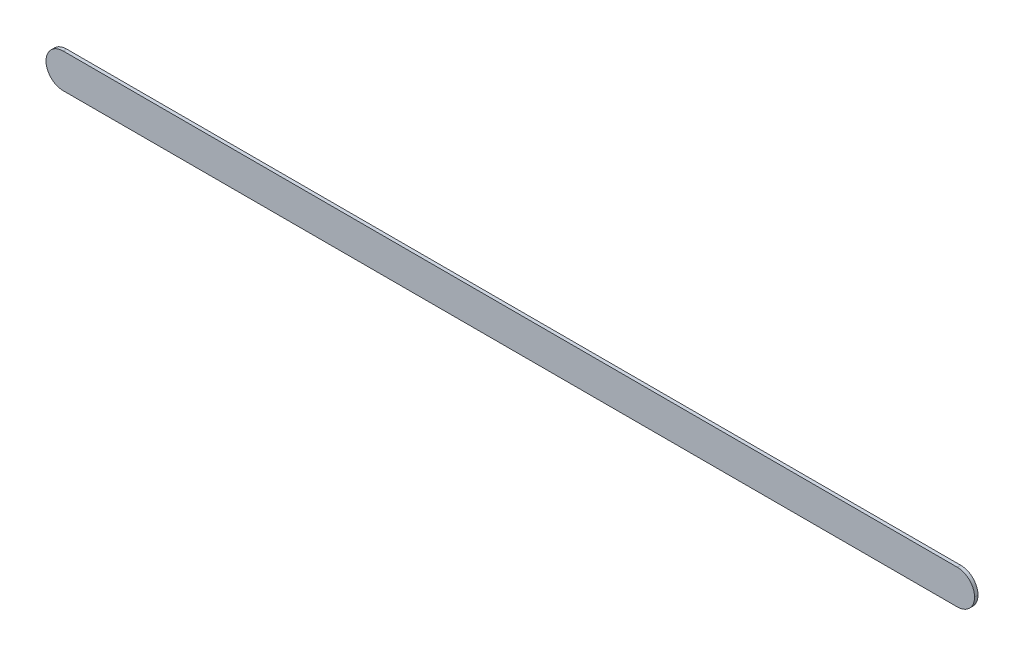
ISO-10303-21;
HEADER;
FILE_DESCRIPTION(('STEP AP214'),'2;1');
FILE_NAME('part.step','',(''),(''),'','','');
FILE_SCHEMA(('AUTOMOTIVE_DESIGN { 1 0 10303 214 1 1 1 1 }'));
ENDSEC;
DATA;
#1=APPLICATION_CONTEXT('core data for automotive mechanical design processes');
#2=APPLICATION_PROTOCOL_DEFINITION('international standard','automotive_design',2000,#1);
#3=PRODUCT_CONTEXT('',#1,'mechanical');
#4=PRODUCT('Part','Part','',(#3));
#5=PRODUCT_RELATED_PRODUCT_CATEGORY('part','',(#4));
#6=PRODUCT_DEFINITION_FORMATION('','',#4);
#7=PRODUCT_DEFINITION_CONTEXT('part definition',#1,'design');
#8=PRODUCT_DEFINITION('design','',#6,#7);
#9=PRODUCT_DEFINITION_SHAPE('','',#8);
#10=(LENGTH_UNIT() NAMED_UNIT(*) SI_UNIT(.MILLI.,.METRE.));
#11=(NAMED_UNIT(*) PLANE_ANGLE_UNIT() SI_UNIT($,.RADIAN.));
#12=(NAMED_UNIT(*) SI_UNIT($,.STERADIAN.) SOLID_ANGLE_UNIT());
#13=UNCERTAINTY_MEASURE_WITH_UNIT(LENGTH_MEASURE(1.E-05),#10,'distance_accuracy_value','');
#14=(GEOMETRIC_REPRESENTATION_CONTEXT(3) GLOBAL_UNCERTAINTY_ASSIGNED_CONTEXT((#13)) GLOBAL_UNIT_ASSIGNED_CONTEXT((#10,
#11,#12)) REPRESENTATION_CONTEXT('',''));
#15=CARTESIAN_POINT('',(0.,0.,0.));
#16=DIRECTION('',(0.,0.,1.));
#17=DIRECTION('',(1.,0.,0.));
#18=AXIS2_PLACEMENT_3D('',#15,#16,#17);
#19=CARTESIAN_POINT('',(16.299999393024,35.383999023438,0.0127));
#20=DIRECTION('',(0.,0.,1.));
#21=DIRECTION('',(1.,0.,0.));
#22=AXIS2_PLACEMENT_3D('',#19,#20,#21);
#23=PLANE('',#22);
#24=CARTESIAN_POINT('',(17.950998535145,35.383999023438,0.0127));
#25=DIRECTION('',(0.,0.,-1.));
#26=DIRECTION('',(1.,0.,0.));
#27=AXIS2_PLACEMENT_3D('',#24,#25,#26);
#28=CIRCLE('',#27,0.06350097657423);
#29=CARTESIAN_POINT('',(17.950999145502,35.4475,0.0127));
#30=VERTEX_POINT('',#29);
#31=CARTESIAN_POINT('',(18.014499511719,35.383999023438,0.0127));
#32=VERTEX_POINT('',#31);
#33=EDGE_CURVE('E28',#30,#32,#28,.T.);
#34=ORIENTED_EDGE('',*,*,#33,.F.);
#35=DIRECTION('',(-1.,0.,0.));
#36=VECTOR('',#35,1.);
#37=CARTESIAN_POINT('',(14.649000244141,35.4475,0.0127));
#38=LINE('',#37,#36);
#39=CARTESIAN_POINT('',(14.649000244141,35.4475,0.0127));
#40=VERTEX_POINT('',#39);
#41=EDGE_CURVE('E87',#30,#40,#38,.T.);
#42=ORIENTED_EDGE('',*,*,#41,.T.);
#43=CARTESIAN_POINT('',(14.649000244141,35.383999023438,0.0127));
#44=DIRECTION('',(0.,0.,1.));
#45=DIRECTION('',(1.,0.,0.));
#46=AXIS2_PLACEMENT_3D('',#43,#44,#45);
#47=CIRCLE('',#46,0.0635009765625);
#48=CARTESIAN_POINT('',(14.649000244141,35.320498046875,0.0127));
#49=VERTEX_POINT('',#48);
#50=EDGE_CURVE('E115',#40,#49,#47,.T.);
#51=ORIENTED_EDGE('',*,*,#50,.T.);
#52=DIRECTION('',(1.,0.,0.));
#53=VECTOR('',#52,1.);
#54=CARTESIAN_POINT('',(17.950999755859,35.320498046875,0.0127));
#55=LINE('',#54,#53);
#56=CARTESIAN_POINT('',(17.950999145502,35.320498046875,0.0127));
#57=VERTEX_POINT('',#56);
#58=EDGE_CURVE('E11',#49,#57,#55,.T.);
#59=ORIENTED_EDGE('',*,*,#58,.T.);
#60=CARTESIAN_POINT('',(17.950998535145,35.383999023438,0.0127));
#61=DIRECTION('',(0.,0.,-1.));
#62=DIRECTION('',(1.,0.,0.));
#63=AXIS2_PLACEMENT_3D('',#60,#61,#62);
#64=CIRCLE('',#63,0.06350097657423);
#65=EDGE_CURVE('E90',#32,#57,#64,.T.);
#66=ORIENTED_EDGE('',*,*,#65,.F.);
#67=EDGE_LOOP('',(#34,#42,#51,#59,#66));
#68=FACE_BOUND('',#67,.T.);
#69=ADVANCED_FACE('F17',(#68),#23,.T.);
#70=CARTESIAN_POINT('',(17.950999755859,35.320498046875,0.));
#71=DIRECTION('',(0.,1.,0.));
#72=DIRECTION('',(1.,0.,0.));
#73=AXIS2_PLACEMENT_3D('',#70,#71,#72);
#74=PLANE('',#73);
#75=DIRECTION('',(0.,0.,1.));
#76=VECTOR('',#75,1.);
#77=CARTESIAN_POINT('',(14.649000244141,35.320498046875,0.));
#78=LINE('',#77,#76);
#79=CARTESIAN_POINT('',(14.649000244141,35.320498046875,0.));
#80=VERTEX_POINT('',#79);
#81=EDGE_CURVE('E119',#80,#49,#78,.T.);
#82=ORIENTED_EDGE('',*,*,#81,.F.);
#83=DIRECTION('',(1.,0.,0.));
#84=VECTOR('',#83,1.);
#85=CARTESIAN_POINT('',(16.299999393024,35.320498046875,0.));
#86=LINE('',#85,#84);
#87=CARTESIAN_POINT('',(17.950999145502,35.320498046875,0.));
#88=VERTEX_POINT('',#87);
#89=EDGE_CURVE('E110',#80,#88,#86,.T.);
#90=ORIENTED_EDGE('',*,*,#89,.T.);
#91=DIRECTION('',(0.,0.,-1.));
#92=VECTOR('',#91,1.);
#93=CARTESIAN_POINT('',(17.950999755859,35.320498046875,0.));
#94=LINE('',#93,#92);
#95=EDGE_CURVE('E96',#57,#88,#94,.T.);
#96=ORIENTED_EDGE('',*,*,#95,.F.);
#97=ORIENTED_EDGE('',*,*,#58,.F.);
#98=EDGE_LOOP('',(#82,#90,#96,#97));
#99=FACE_BOUND('',#98,.T.);
#100=ADVANCED_FACE('F180',(#99),#74,.F.);
#101=CARTESIAN_POINT('',(17.950998535145,35.383999023438,0.));
#102=DIRECTION('',(0.,0.,1.));
#103=DIRECTION('',(1.,0.,0.));
#104=AXIS2_PLACEMENT_3D('',#101,#102,#103);
#105=CYLINDRICAL_SURFACE('',#104,0.06350097657423);
#106=DIRECTION('',(0.,0.,1.));
#107=VECTOR('',#106,1.);
#108=CARTESIAN_POINT('',(18.014499511719,35.383999023438,0.));
#109=LINE('',#108,#107);
#110=CARTESIAN_POINT('',(18.014499511719,35.383999023438,0.));
#111=VERTEX_POINT('',#110);
#112=EDGE_CURVE('E84',#111,#32,#109,.T.);
#113=ORIENTED_EDGE('',*,*,#112,.F.);
#114=CARTESIAN_POINT('',(17.950998535145,35.383999023438,0.));
#115=DIRECTION('',(0.,0.,1.));
#116=DIRECTION('',(1.,0.,0.));
#117=AXIS2_PLACEMENT_3D('',#114,#115,#116);
#118=CIRCLE('',#117,0.06350097657423);
#119=CARTESIAN_POINT('',(17.950999145502,35.4475,0.));
#120=VERTEX_POINT('',#119);
#121=EDGE_CURVE('E76',#111,#120,#118,.T.);
#122=ORIENTED_EDGE('',*,*,#121,.T.);
#123=DIRECTION('',(0.,0.,1.));
#124=VECTOR('',#123,1.);
#125=CARTESIAN_POINT('',(17.950999755859,35.4475,0.));
#126=LINE('',#125,#124);
#127=EDGE_CURVE('E21',#120,#30,#126,.T.);
#128=ORIENTED_EDGE('',*,*,#127,.T.);
#129=ORIENTED_EDGE('',*,*,#33,.T.);
#130=EDGE_LOOP('',(#113,#122,#128,#129));
#131=FACE_BOUND('',#130,.T.);
#132=ADVANCED_FACE('F82',(#131),#105,.T.);
#133=CARTESIAN_POINT('',(14.649000244141,35.4475,0.));
#134=DIRECTION('',(0.,-1.,0.));
#135=DIRECTION('',(0.,0.,-1.));
#136=AXIS2_PLACEMENT_3D('',#133,#134,#135);
#137=PLANE('',#136);
#138=ORIENTED_EDGE('',*,*,#127,.F.);
#139=DIRECTION('',(-1.,0.,0.));
#140=VECTOR('',#139,1.);
#141=CARTESIAN_POINT('',(16.299999393024,35.4475,0.));
#142=LINE('',#141,#140);
#143=CARTESIAN_POINT('',(14.649000244141,35.4475,0.));
#144=VERTEX_POINT('',#143);
#145=EDGE_CURVE('E111',#120,#144,#142,.T.);
#146=ORIENTED_EDGE('',*,*,#145,.T.);
#147=DIRECTION('',(0.,0.,-1.));
#148=VECTOR('',#147,1.);
#149=CARTESIAN_POINT('',(14.649000244141,35.4475,0.));
#150=LINE('',#149,#148);
#151=EDGE_CURVE('E112',#40,#144,#150,.T.);
#152=ORIENTED_EDGE('',*,*,#151,.F.);
#153=ORIENTED_EDGE('',*,*,#41,.F.);
#154=EDGE_LOOP('',(#138,#146,#152,#153));
#155=FACE_BOUND('',#154,.T.);
#156=ADVANCED_FACE('F185',(#155),#137,.F.);
#157=CARTESIAN_POINT('',(14.649000244141,35.383999023438,0.));
#158=DIRECTION('',(0.,0.,1.));
#159=DIRECTION('',(1.,0.,0.));
#160=AXIS2_PLACEMENT_3D('',#157,#158,#159);
#161=CYLINDRICAL_SURFACE('',#160,0.0635009765625);
#162=CARTESIAN_POINT('',(14.649000244141,35.383999023438,0.));
#163=DIRECTION('',(0.,0.,1.));
#164=DIRECTION('',(1.,0.,0.));
#165=AXIS2_PLACEMENT_3D('',#162,#163,#164);
#166=CIRCLE('',#165,0.0635009765625);
#167=EDGE_CURVE('E116',#144,#80,#166,.T.);
#168=ORIENTED_EDGE('',*,*,#167,.T.);
#169=ORIENTED_EDGE('',*,*,#81,.T.);
#170=ORIENTED_EDGE('',*,*,#50,.F.);
#171=ORIENTED_EDGE('',*,*,#151,.T.);
#172=EDGE_LOOP('',(#168,#169,#170,#171));
#173=FACE_BOUND('',#172,.T.);
#174=ADVANCED_FACE('F183',(#173),#161,.T.);
#175=CARTESIAN_POINT('',(16.299999393024,35.383999023438,0.));
#176=DIRECTION('',(0.,0.,1.));
#177=DIRECTION('',(1.,0.,0.));
#178=AXIS2_PLACEMENT_3D('',#175,#176,#177);
#179=PLANE('',#178);
#180=ORIENTED_EDGE('',*,*,#145,.F.);
#181=ORIENTED_EDGE('',*,*,#121,.F.);
#182=CARTESIAN_POINT('',(17.950998535145,35.383999023438,0.));
#183=DIRECTION('',(0.,0.,1.));
#184=DIRECTION('',(1.,0.,0.));
#185=AXIS2_PLACEMENT_3D('',#182,#183,#184);
#186=CIRCLE('',#185,0.06350097657423);
#187=EDGE_CURVE('E98',#88,#111,#186,.T.);
#188=ORIENTED_EDGE('',*,*,#187,.F.);
#189=ORIENTED_EDGE('',*,*,#89,.F.);
#190=ORIENTED_EDGE('',*,*,#167,.F.);
#191=EDGE_LOOP('',(#180,#181,#188,#189,#190));
#192=FACE_BOUND('',#191,.T.);
#193=ADVANCED_FACE('F178',(#192),#179,.F.);
#194=CARTESIAN_POINT('',(17.950998535145,35.383999023438,0.));
#195=DIRECTION('',(0.,0.,1.));
#196=DIRECTION('',(1.,0.,0.));
#197=AXIS2_PLACEMENT_3D('',#194,#195,#196);
#198=CYLINDRICAL_SURFACE('',#197,0.06350097657423);
#199=ORIENTED_EDGE('',*,*,#187,.T.);
#200=ORIENTED_EDGE('',*,*,#112,.T.);
#201=ORIENTED_EDGE('',*,*,#65,.T.);
#202=ORIENTED_EDGE('',*,*,#95,.T.);
#203=EDGE_LOOP('',(#199,#200,#201,#202));
#204=FACE_BOUND('',#203,.T.);
#205=ADVANCED_FACE('F19',(#204),#198,.T.);
#206=CLOSED_SHELL('',(#69,#100,#132,#156,#174,#193,#205));
#207=MANIFOLD_SOLID_BREP('B1',#206);
#208=ADVANCED_BREP_SHAPE_REPRESENTATION('',(#18,#207),#14);
#209=SHAPE_DEFINITION_REPRESENTATION(#9,#208);
ENDSEC;
END-ISO-10303-21;
